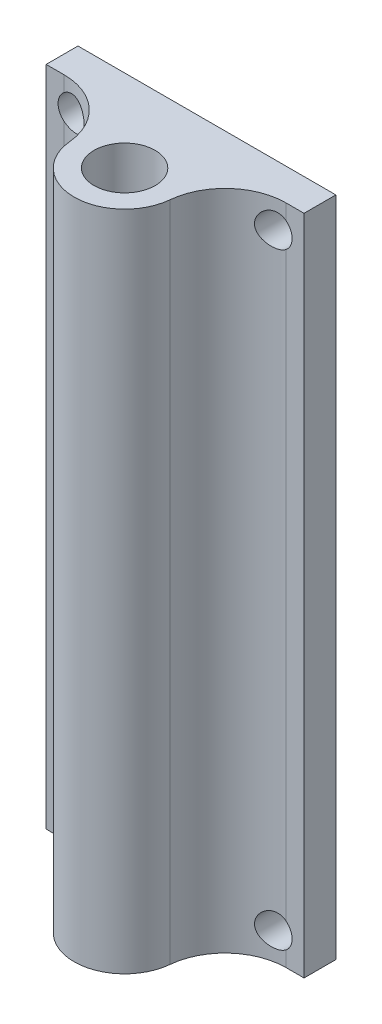
ISO-10303-21;
HEADER;
FILE_DESCRIPTION(('STEP AP214'),'2;1');
FILE_NAME('part.step','',(''),(''),'','','');
FILE_SCHEMA(('AUTOMOTIVE_DESIGN { 1 0 10303 214 1 1 1 1 }'));
ENDSEC;
DATA;
#1=APPLICATION_CONTEXT('core data for automotive mechanical design processes');
#2=APPLICATION_PROTOCOL_DEFINITION('international standard','automotive_design',2000,#1);
#3=PRODUCT_CONTEXT('',#1,'mechanical');
#4=PRODUCT('Part','Part','',(#3));
#5=PRODUCT_RELATED_PRODUCT_CATEGORY('part','',(#4));
#6=PRODUCT_DEFINITION_FORMATION('','',#4);
#7=PRODUCT_DEFINITION_CONTEXT('part definition',#1,'design');
#8=PRODUCT_DEFINITION('design','',#6,#7);
#9=PRODUCT_DEFINITION_SHAPE('','',#8);
#10=(LENGTH_UNIT() NAMED_UNIT(*) SI_UNIT(.MILLI.,.METRE.));
#11=(NAMED_UNIT(*) PLANE_ANGLE_UNIT() SI_UNIT($,.RADIAN.));
#12=(NAMED_UNIT(*) SI_UNIT($,.STERADIAN.) SOLID_ANGLE_UNIT());
#13=UNCERTAINTY_MEASURE_WITH_UNIT(LENGTH_MEASURE(1.E-05),#10,'distance_accuracy_value','');
#14=(GEOMETRIC_REPRESENTATION_CONTEXT(3) GLOBAL_UNCERTAINTY_ASSIGNED_CONTEXT((#13)) GLOBAL_UNIT_ASSIGNED_CONTEXT((#10,
#11,#12)) REPRESENTATION_CONTEXT('',''));
#15=CARTESIAN_POINT('',(0.,0.,0.));
#16=DIRECTION('',(0.,0.,1.));
#17=DIRECTION('',(1.,0.,0.));
#18=AXIS2_PLACEMENT_3D('',#15,#16,#17);
#19=CARTESIAN_POINT('',(0.,83.2,0.));
#20=DIRECTION('',(0.,-1.,0.));
#21=DIRECTION('',(0.,0.,-1.));
#22=AXIS2_PLACEMENT_3D('',#19,#20,#21);
#23=CYLINDRICAL_SURFACE('',#22,6.34);
#24=CARTESIAN_POINT('',(0.,83.2,0.));
#25=DIRECTION('',(0.,1.,0.));
#26=DIRECTION('',(0.,0.,1.));
#27=AXIS2_PLACEMENT_3D('',#24,#25,#26);
#28=CIRCLE('',#27,6.34);
#29=CARTESIAN_POINT('',(-6.31097527736789,83.2,0.605962910128388));
#30=VERTEX_POINT('',#29);
#31=CARTESIAN_POINT('',(6.31097527736789,83.2,0.605962910128388));
#32=VERTEX_POINT('',#31);
#33=EDGE_CURVE('E266',#30,#32,#28,.T.);
#34=ORIENTED_EDGE('',*,*,#33,.F.);
#35=DIRECTION('',(0.,-1.,0.));
#36=VECTOR('',#35,1.);
#37=CARTESIAN_POINT('',(-6.31097527736789,83.2,0.605962910128388));
#38=LINE('',#37,#36);
#39=CARTESIAN_POINT('',(-6.31097527736789,0.,0.605962910128388));
#40=VERTEX_POINT('',#39);
#41=EDGE_CURVE('E298',#30,#40,#38,.T.);
#42=ORIENTED_EDGE('',*,*,#41,.T.);
#43=CARTESIAN_POINT('',(0.,0.,0.));
#44=DIRECTION('',(0.,1.,0.));
#45=DIRECTION('',(0.,0.,1.));
#46=AXIS2_PLACEMENT_3D('',#43,#44,#45);
#47=CIRCLE('',#46,6.34);
#48=CARTESIAN_POINT('',(6.31097527736789,0.,0.605962910128388));
#49=VERTEX_POINT('',#48);
#50=EDGE_CURVE('E260',#40,#49,#47,.T.);
#51=ORIENTED_EDGE('',*,*,#50,.T.);
#52=DIRECTION('',(0.,-1.,0.));
#53=VECTOR('',#52,1.);
#54=CARTESIAN_POINT('',(6.31097527736789,83.2,0.605962910128388));
#55=LINE('',#54,#53);
#56=EDGE_CURVE('E295',#49,#32,#55,.F.);
#57=ORIENTED_EDGE('',*,*,#56,.T.);
#58=EDGE_LOOP('',(#34,#42,#51,#57));
#59=FACE_BOUND('',#58,.T.);
#60=ADVANCED_FACE('F45',(#59),#23,.T.);
#61=CARTESIAN_POINT('',(0.,83.2,-6.34));
#62=DIRECTION('',(0.,0.,-1.));
#63=DIRECTION('',(-1.,0.,0.));
#64=AXIS2_PLACEMENT_3D('',#61,#62,#63);
#65=PLANE('',#64);
#66=DIRECTION('',(0.,1.,0.));
#67=VECTOR('',#66,1.);
#68=CARTESIAN_POINT('',(13.9558159919082,0.,-6.34));
#69=LINE('',#68,#67);
#70=CARTESIAN_POINT('',(13.9558159919082,83.2,-6.34));
#71=VERTEX_POINT('',#70);
#72=CARTESIAN_POINT('',(13.9558159919082,81.2565751489946,-6.34));
#73=VERTEX_POINT('',#72);
#74=EDGE_CURVE('E166',#71,#73,#69,.F.);
#75=ORIENTED_EDGE('',*,*,#74,.T.);
#76=CARTESIAN_POINT('',(12.7,79.7,-6.34));
#77=DIRECTION('',(0.,0.,-1.));
#78=DIRECTION('',(-1.,0.,0.));
#79=AXIS2_PLACEMENT_3D('',#76,#77,#78);
#80=CIRCLE('',#79,2.00000000000001);
#81=CARTESIAN_POINT('',(13.9558159919082,78.1434248510053,-6.34));
#82=VERTEX_POINT('',#81);
#83=EDGE_CURVE('E366',#73,#82,#80,.T.);
#84=ORIENTED_EDGE('',*,*,#83,.T.);
#85=CARTESIAN_POINT('',(13.9558159919082,5.05657514899463,-6.34));
#86=VERTEX_POINT('',#85);
#87=EDGE_CURVE('E156',#82,#86,#69,.F.);
#88=ORIENTED_EDGE('',*,*,#87,.T.);
#89=CARTESIAN_POINT('',(12.7,3.49999999999999,-6.34));
#90=DIRECTION('',(0.,0.,-1.));
#91=DIRECTION('',(-1.,0.,0.));
#92=AXIS2_PLACEMENT_3D('',#89,#90,#91);
#93=CIRCLE('',#92,2.);
#94=CARTESIAN_POINT('',(13.9558159919082,1.94342485100536,-6.34));
#95=VERTEX_POINT('',#94);
#96=EDGE_CURVE('E141',#86,#95,#93,.T.);
#97=ORIENTED_EDGE('',*,*,#96,.T.);
#98=CARTESIAN_POINT('',(13.9558159919082,0.,-6.34));
#99=VERTEX_POINT('',#98);
#100=EDGE_CURVE('E153',#95,#99,#69,.F.);
#101=ORIENTED_EDGE('',*,*,#100,.T.);
#102=DIRECTION('',(1.,0.,0.));
#103=VECTOR('',#102,1.);
#104=CARTESIAN_POINT('',(0.,0.,-6.34));
#105=LINE('',#104,#103);
#106=CARTESIAN_POINT('',(16.2,0.,-6.34));
#107=VERTEX_POINT('',#106);
#108=EDGE_CURVE('E340',#99,#107,#105,.T.);
#109=ORIENTED_EDGE('',*,*,#108,.T.);
#110=DIRECTION('',(0.,-1.,0.));
#111=VECTOR('',#110,1.);
#112=CARTESIAN_POINT('',(16.2,83.2,-6.34));
#113=LINE('',#112,#111);
#114=CARTESIAN_POINT('',(16.2,83.2,-6.34));
#115=VERTEX_POINT('',#114);
#116=EDGE_CURVE('E291',#115,#107,#113,.T.);
#117=ORIENTED_EDGE('',*,*,#116,.F.);
#118=DIRECTION('',(1.,0.,0.));
#119=VECTOR('',#118,1.);
#120=CARTESIAN_POINT('',(0.,83.2,-6.34));
#121=LINE('',#120,#119);
#122=EDGE_CURVE('E273',#71,#115,#121,.T.);
#123=ORIENTED_EDGE('',*,*,#122,.F.);
#124=EDGE_LOOP('',(#75,#84,#88,#97,#101,#109,#117,#123));
#125=FACE_BOUND('',#124,.T.);
#126=ADVANCED_FACE('F152',(#125),#65,.F.);
#127=CARTESIAN_POINT('',(16.2,83.2,0.));
#128=DIRECTION('',(-1.,0.,0.));
#129=DIRECTION('',(0.,0.,1.));
#130=AXIS2_PLACEMENT_3D('',#127,#128,#129);
#131=PLANE('',#130);
#132=DIRECTION('',(0.,0.,-1.));
#133=VECTOR('',#132,1.);
#134=CARTESIAN_POINT('',(16.2,0.,0.));
#135=LINE('',#134,#133);
#136=CARTESIAN_POINT('',(16.2,0.,-10.34));
#137=VERTEX_POINT('',#136);
#138=EDGE_CURVE('E344',#107,#137,#135,.T.);
#139=ORIENTED_EDGE('',*,*,#138,.T.);
#140=DIRECTION('',(0.,-1.,0.));
#141=VECTOR('',#140,1.);
#142=CARTESIAN_POINT('',(16.2,83.2,-10.34));
#143=LINE('',#142,#141);
#144=CARTESIAN_POINT('',(16.2,83.2,-10.34));
#145=VERTEX_POINT('',#144);
#146=EDGE_CURVE('E288',#145,#137,#143,.T.);
#147=ORIENTED_EDGE('',*,*,#146,.F.);
#148=DIRECTION('',(0.,0.,-1.));
#149=VECTOR('',#148,1.);
#150=CARTESIAN_POINT('',(16.2,83.2,0.));
#151=LINE('',#150,#149);
#152=EDGE_CURVE('E319',#115,#145,#151,.T.);
#153=ORIENTED_EDGE('',*,*,#152,.F.);
#154=ORIENTED_EDGE('',*,*,#116,.T.);
#155=EDGE_LOOP('',(#139,#147,#153,#154));
#156=FACE_BOUND('',#155,.T.);
#157=ADVANCED_FACE('F234',(#156),#131,.F.);
#158=CARTESIAN_POINT('',(0.,83.2,-10.34));
#159=DIRECTION('',(0.,0.,-1.));
#160=DIRECTION('',(-1.,0.,0.));
#161=AXIS2_PLACEMENT_3D('',#158,#159,#160);
#162=PLANE('',#161);
#163=CARTESIAN_POINT('',(12.7,79.7,-10.34));
#164=DIRECTION('',(0.,0.,-1.));
#165=DIRECTION('',(-1.,0.,0.));
#166=AXIS2_PLACEMENT_3D('',#163,#164,#165);
#167=CIRCLE('',#166,2.00000000000001);
#168=CARTESIAN_POINT('',(10.7,79.7,-10.34));
#169=VERTEX_POINT('',#168);
#170=EDGE_CURVE('E360',#169,#169,#167,.T.);
#171=ORIENTED_EDGE('',*,*,#170,.F.);
#172=EDGE_LOOP('',(#171));
#173=FACE_BOUND('',#172,.T.);
#174=CARTESIAN_POINT('',(12.7,3.49999999999999,-10.34));
#175=DIRECTION('',(0.,0.,-1.));
#176=DIRECTION('',(-1.,0.,0.));
#177=AXIS2_PLACEMENT_3D('',#174,#175,#176);
#178=CIRCLE('',#177,2.);
#179=CARTESIAN_POINT('',(10.7,3.49999999999999,-10.34));
#180=VERTEX_POINT('',#179);
#181=EDGE_CURVE('E158',#180,#180,#178,.T.);
#182=ORIENTED_EDGE('',*,*,#181,.F.);
#183=EDGE_LOOP('',(#182));
#184=FACE_BOUND('',#183,.T.);
#185=CARTESIAN_POINT('',(-12.7,3.49999999999999,-10.34));
#186=DIRECTION('',(0.,0.,-1.));
#187=DIRECTION('',(-1.,0.,0.));
#188=AXIS2_PLACEMENT_3D('',#185,#186,#187);
#189=CIRCLE('',#188,2.);
#190=CARTESIAN_POINT('',(-14.7,3.49999999999999,-10.34));
#191=VERTEX_POINT('',#190);
#192=EDGE_CURVE('E341',#191,#191,#189,.T.);
#193=ORIENTED_EDGE('',*,*,#192,.F.);
#194=EDGE_LOOP('',(#193));
#195=FACE_BOUND('',#194,.T.);
#196=CARTESIAN_POINT('',(-12.7,79.7,-10.34));
#197=DIRECTION('',(0.,0.,-1.));
#198=DIRECTION('',(-1.,0.,0.));
#199=AXIS2_PLACEMENT_3D('',#196,#197,#198);
#200=CIRCLE('',#199,2.);
#201=CARTESIAN_POINT('',(-14.7,79.7,-10.34));
#202=VERTEX_POINT('',#201);
#203=EDGE_CURVE('E359',#202,#202,#200,.T.);
#204=ORIENTED_EDGE('',*,*,#203,.F.);
#205=EDGE_LOOP('',(#204));
#206=FACE_BOUND('',#205,.T.);
#207=DIRECTION('',(1.,0.,0.));
#208=VECTOR('',#207,1.);
#209=CARTESIAN_POINT('',(0.,0.,-10.34));
#210=LINE('',#209,#208);
#211=CARTESIAN_POINT('',(-16.2,0.,-10.34));
#212=VERTEX_POINT('',#211);
#213=EDGE_CURVE('E348',#212,#137,#210,.T.);
#214=ORIENTED_EDGE('',*,*,#213,.F.);
#215=DIRECTION('',(0.,-1.,0.));
#216=VECTOR('',#215,1.);
#217=CARTESIAN_POINT('',(-16.2,83.2,-10.34));
#218=LINE('',#217,#216);
#219=CARTESIAN_POINT('',(-16.2,83.2,-10.34));
#220=VERTEX_POINT('',#219);
#221=EDGE_CURVE('E284',#220,#212,#218,.T.);
#222=ORIENTED_EDGE('',*,*,#221,.F.);
#223=DIRECTION('',(1.,0.,0.));
#224=VECTOR('',#223,1.);
#225=CARTESIAN_POINT('',(0.,83.2,-10.34));
#226=LINE('',#225,#224);
#227=EDGE_CURVE('E322',#220,#145,#226,.T.);
#228=ORIENTED_EDGE('',*,*,#227,.T.);
#229=ORIENTED_EDGE('',*,*,#146,.T.);
#230=EDGE_LOOP('',(#214,#222,#228,#229));
#231=FACE_BOUND('',#230,.T.);
#232=ADVANCED_FACE('F237',(#173,#184,#195,#206,#231),#162,.T.);
#233=CARTESIAN_POINT('',(-16.2,83.2,0.));
#234=DIRECTION('',(-1.,0.,0.));
#235=DIRECTION('',(0.,0.,1.));
#236=AXIS2_PLACEMENT_3D('',#233,#234,#235);
#237=PLANE('',#236);
#238=DIRECTION('',(0.,0.,-1.));
#239=VECTOR('',#238,1.);
#240=CARTESIAN_POINT('',(-16.2,0.,0.));
#241=LINE('',#240,#239);
#242=CARTESIAN_POINT('',(-16.2,0.,-6.34));
#243=VERTEX_POINT('',#242);
#244=EDGE_CURVE('E276',#243,#212,#241,.T.);
#245=ORIENTED_EDGE('',*,*,#244,.F.);
#246=DIRECTION('',(0.,-1.,0.));
#247=VECTOR('',#246,1.);
#248=CARTESIAN_POINT('',(-16.2,83.2,-6.34));
#249=LINE('',#248,#247);
#250=CARTESIAN_POINT('',(-16.2,83.2,-6.34));
#251=VERTEX_POINT('',#250);
#252=EDGE_CURVE('E280',#251,#243,#249,.T.);
#253=ORIENTED_EDGE('',*,*,#252,.F.);
#254=DIRECTION('',(0.,0.,-1.));
#255=VECTOR('',#254,1.);
#256=CARTESIAN_POINT('',(-16.2,83.2,0.));
#257=LINE('',#256,#255);
#258=EDGE_CURVE('E329',#251,#220,#257,.T.);
#259=ORIENTED_EDGE('',*,*,#258,.T.);
#260=ORIENTED_EDGE('',*,*,#221,.T.);
#261=EDGE_LOOP('',(#245,#253,#259,#260));
#262=FACE_BOUND('',#261,.T.);
#263=ADVANCED_FACE('F241',(#262),#237,.T.);
#264=CARTESIAN_POINT('',(0.,83.2,-6.34));
#265=DIRECTION('',(0.,0.,1.));
#266=DIRECTION('',(1.,0.,0.));
#267=AXIS2_PLACEMENT_3D('',#264,#265,#266);
#268=PLANE('',#267);
#269=CARTESIAN_POINT('',(-12.7,3.49999999999999,-6.34));
#270=DIRECTION('',(0.,0.,1.));
#271=DIRECTION('',(1.,0.,0.));
#272=AXIS2_PLACEMENT_3D('',#269,#270,#271);
#273=CIRCLE('',#272,2.);
#274=CARTESIAN_POINT('',(-13.9558159919082,5.05657514899463,-6.34));
#275=VERTEX_POINT('',#274);
#276=CARTESIAN_POINT('',(-13.9558159919082,1.94342485100535,-6.34));
#277=VERTEX_POINT('',#276);
#278=EDGE_CURVE('E72',#275,#277,#273,.T.);
#279=ORIENTED_EDGE('',*,*,#278,.F.);
#280=DIRECTION('',(0.,-1.,0.));
#281=VECTOR('',#280,1.);
#282=CARTESIAN_POINT('',(-13.9558159919082,83.2,-6.34));
#283=LINE('',#282,#281);
#284=CARTESIAN_POINT('',(-13.9558159919082,78.1434248510053,-6.34));
#285=VERTEX_POINT('',#284);
#286=EDGE_CURVE('E171',#275,#285,#283,.F.);
#287=ORIENTED_EDGE('',*,*,#286,.T.);
#288=CARTESIAN_POINT('',(-12.7,79.7,-6.34));
#289=DIRECTION('',(0.,0.,1.));
#290=DIRECTION('',(1.,0.,0.));
#291=AXIS2_PLACEMENT_3D('',#288,#289,#290);
#292=CIRCLE('',#291,2.);
#293=CARTESIAN_POINT('',(-13.9558159919082,81.2565751489946,-6.34));
#294=VERTEX_POINT('',#293);
#295=EDGE_CURVE('E65',#294,#285,#292,.T.);
#296=ORIENTED_EDGE('',*,*,#295,.F.);
#297=CARTESIAN_POINT('',(-13.9558159919082,83.2,-6.34));
#298=VERTEX_POINT('',#297);
#299=EDGE_CURVE('E173',#294,#298,#283,.F.);
#300=ORIENTED_EDGE('',*,*,#299,.T.);
#301=DIRECTION('',(-1.,0.,0.));
#302=VECTOR('',#301,1.);
#303=CARTESIAN_POINT('',(0.,83.2,-6.34));
#304=LINE('',#303,#302);
#305=EDGE_CURVE('E314',#298,#251,#304,.T.);
#306=ORIENTED_EDGE('',*,*,#305,.T.);
#307=ORIENTED_EDGE('',*,*,#252,.T.);
#308=DIRECTION('',(-1.,0.,0.));
#309=VECTOR('',#308,1.);
#310=CARTESIAN_POINT('',(0.,0.,-6.34));
#311=LINE('',#310,#309);
#312=CARTESIAN_POINT('',(-13.9558159919082,0.,-6.34));
#313=VERTEX_POINT('',#312);
#314=EDGE_CURVE('E267',#313,#243,#311,.T.);
#315=ORIENTED_EDGE('',*,*,#314,.F.);
#316=EDGE_CURVE('E164',#313,#277,#283,.F.);
#317=ORIENTED_EDGE('',*,*,#316,.T.);
#318=EDGE_LOOP('',(#279,#287,#296,#300,#306,#307,#315,#317));
#319=FACE_BOUND('',#318,.T.);
#320=ADVANCED_FACE('F245',(#319),#268,.T.);
#321=CARTESIAN_POINT('',(0.,83.2,0.));
#322=DIRECTION('',(0.,-1.,0.));
#323=DIRECTION('',(0.,0.,-1.));
#324=AXIS2_PLACEMENT_3D('',#321,#322,#323);
#325=CYLINDRICAL_SURFACE('',#324,3.84);
#326=CARTESIAN_POINT('',(0.,83.2,0.));
#327=DIRECTION('',(0.,1.,0.));
#328=DIRECTION('',(0.,0.,1.));
#329=AXIS2_PLACEMENT_3D('',#326,#327,#328);
#330=CIRCLE('',#329,3.84);
#331=CARTESIAN_POINT('',(0.,83.2,3.84));
#332=VERTEX_POINT('',#331);
#333=EDGE_CURVE('E285',#332,#332,#330,.T.);
#334=ORIENTED_EDGE('',*,*,#333,.T.);
#335=EDGE_LOOP('',(#334));
#336=FACE_BOUND('',#335,.T.);
#337=CARTESIAN_POINT('',(0.,0.,0.));
#338=DIRECTION('',(0.,1.,0.));
#339=DIRECTION('',(0.,0.,1.));
#340=AXIS2_PLACEMENT_3D('',#337,#338,#339);
#341=CIRCLE('',#340,3.84);
#342=CARTESIAN_POINT('',(0.,0.,3.84));
#343=VERTEX_POINT('',#342);
#344=EDGE_CURVE('E263',#343,#343,#341,.T.);
#345=ORIENTED_EDGE('',*,*,#344,.F.);
#346=EDGE_LOOP('',(#345));
#347=FACE_BOUND('',#346,.T.);
#348=ADVANCED_FACE('F249',(#336,#347),#325,.F.);
#349=CARTESIAN_POINT('',(0.,83.2,0.));
#350=DIRECTION('',(0.,1.,0.));
#351=DIRECTION('',(0.,0.,1.));
#352=AXIS2_PLACEMENT_3D('',#349,#350,#351);
#353=PLANE('',#352);
#354=ORIENTED_EDGE('',*,*,#305,.F.);
#355=CARTESIAN_POINT('',(-13.9558159919082,83.2,1.34));
#356=DIRECTION('',(0.,1.,0.));
#357=DIRECTION('',(0.,0.,1.));
#358=AXIS2_PLACEMENT_3D('',#355,#356,#357);
#359=CIRCLE('',#358,7.68);
#360=EDGE_CURVE('E181',#298,#30,#359,.F.);
#361=ORIENTED_EDGE('',*,*,#360,.T.);
#362=ORIENTED_EDGE('',*,*,#33,.T.);
#363=CARTESIAN_POINT('',(13.9558159919082,83.2,1.34));
#364=DIRECTION('',(0.,1.,0.));
#365=DIRECTION('',(0.,0.,1.));
#366=AXIS2_PLACEMENT_3D('',#363,#364,#365);
#367=CIRCLE('',#366,7.68);
#368=EDGE_CURVE('E148',#32,#71,#367,.F.);
#369=ORIENTED_EDGE('',*,*,#368,.T.);
#370=ORIENTED_EDGE('',*,*,#122,.T.);
#371=ORIENTED_EDGE('',*,*,#152,.T.);
#372=ORIENTED_EDGE('',*,*,#227,.F.);
#373=ORIENTED_EDGE('',*,*,#258,.F.);
#374=EDGE_LOOP('',(#354,#361,#362,#369,#370,#371,#372,#373));
#375=FACE_BOUND('',#374,.T.);
#376=ORIENTED_EDGE('',*,*,#333,.F.);
#377=EDGE_LOOP('',(#376));
#378=FACE_BOUND('',#377,.T.);
#379=ADVANCED_FACE('F216',(#375,#378),#353,.T.);
#380=CARTESIAN_POINT('',(0.,0.,0.));
#381=DIRECTION('',(0.,1.,0.));
#382=DIRECTION('',(0.,0.,1.));
#383=AXIS2_PLACEMENT_3D('',#380,#381,#382);
#384=PLANE('',#383);
#385=ORIENTED_EDGE('',*,*,#50,.F.);
#386=CARTESIAN_POINT('',(-13.9558159919082,0.,1.34));
#387=DIRECTION('',(0.,1.,0.));
#388=DIRECTION('',(0.,0.,1.));
#389=AXIS2_PLACEMENT_3D('',#386,#387,#388);
#390=CIRCLE('',#389,7.68);
#391=EDGE_CURVE('E176',#40,#313,#390,.T.);
#392=ORIENTED_EDGE('',*,*,#391,.T.);
#393=ORIENTED_EDGE('',*,*,#314,.T.);
#394=ORIENTED_EDGE('',*,*,#244,.T.);
#395=ORIENTED_EDGE('',*,*,#213,.T.);
#396=ORIENTED_EDGE('',*,*,#138,.F.);
#397=ORIENTED_EDGE('',*,*,#108,.F.);
#398=CARTESIAN_POINT('',(13.9558159919082,0.,1.34));
#399=DIRECTION('',(0.,1.,0.));
#400=DIRECTION('',(0.,0.,1.));
#401=AXIS2_PLACEMENT_3D('',#398,#399,#400);
#402=CIRCLE('',#401,7.68);
#403=EDGE_CURVE('E161',#99,#49,#402,.T.);
#404=ORIENTED_EDGE('',*,*,#403,.T.);
#405=EDGE_LOOP('',(#385,#392,#393,#394,#395,#396,#397,#404));
#406=FACE_BOUND('',#405,.T.);
#407=ORIENTED_EDGE('',*,*,#344,.T.);
#408=EDGE_LOOP('',(#407));
#409=FACE_BOUND('',#408,.T.);
#410=ADVANCED_FACE('F226',(#406,#409),#384,.F.);
#411=CARTESIAN_POINT('',(-13.9558159919082,83.2,1.34));
#412=DIRECTION('',(0.,-1.,0.));
#413=DIRECTION('',(0.,0.,-1.));
#414=AXIS2_PLACEMENT_3D('',#411,#412,#413);
#415=CYLINDRICAL_SURFACE('',#414,7.68);
#416=ORIENTED_EDGE('',*,*,#286,.F.);
#417=CARTESIAN_POINT('',(-13.9558159919082,5.05657514899463,-6.34));
#418=CARTESIAN_POINT('',(-13.8702324707879,5.1256194487321,-6.33999871740539));
#419=CARTESIAN_POINT('',(-13.7789206832588,5.18760532475056,-6.3385606549177));
#420=CARTESIAN_POINT('',(-13.5874443616998,5.29569892722417,-6.3317580380105));
#421=CARTESIAN_POINT('',(-13.4872776803809,5.34180278898529,-6.32639252888599));
#422=CARTESIAN_POINT('',(-13.2810378732316,5.416882159956,-6.31099718143919));
#423=CARTESIAN_POINT('',(-13.1749640414496,5.44585561711823,-6.30096678456804));
#424=CARTESIAN_POINT('',(-12.960087759229,5.48602673747936,-6.27594518523544));
#425=CARTESIAN_POINT('',(-12.8512854749883,5.49722548072878,-6.26095428425755));
#426=CARTESIAN_POINT('',(-12.6342085650277,5.50186076223654,-6.22622919483338));
#427=CARTESIAN_POINT('',(-12.525933474724,5.49531781908645,-6.20650050978094));
#428=CARTESIAN_POINT('',(-12.3126586121565,5.46508887188854,-6.16295216451284));
#429=CARTESIAN_POINT('',(-12.2076594122902,5.44139988921253,-6.13913179403367));
#430=CARTESIAN_POINT('',(-11.9999215784337,5.37673457082818,-6.08756534954626));
#431=CARTESIAN_POINT('',(-11.8973879276359,5.33518670240231,-6.05971170858855));
#432=CARTESIAN_POINT('',(-11.7009109705249,5.23606981953398,-6.00222702763774));
#433=CARTESIAN_POINT('',(-11.6069704774661,5.17849558309375,-5.97259541078558));
#434=CARTESIAN_POINT('',(-11.4254885920492,5.04559777310098,-5.91185762686719));
#435=CARTESIAN_POINT('',(-11.3384767039303,4.96955021771116,-5.88074948081424));
#436=CARTESIAN_POINT('',(-11.1784453193398,4.80314907728198,-5.82072139139416));
#437=CARTESIAN_POINT('',(-11.105428226671,4.71279303941818,-5.79180182446159));
#438=CARTESIAN_POINT('',(-10.9756303189598,4.51983492397461,-5.7385469883183));
#439=CARTESIAN_POINT('',(-10.9188488633746,4.41723332974385,-5.71421153826385));
#440=CARTESIAN_POINT('',(-10.8237640775259,4.20249502189553,-5.6725153037993));
#441=CARTESIAN_POINT('',(-10.7854476799476,4.09036511755257,-5.65514958852055));
#442=CARTESIAN_POINT('',(-10.7312402598187,3.86878360263483,-5.63031836329529));
#443=CARTESIAN_POINT('',(-10.7138798427085,3.75976441713571,-5.62220669858042));
#444=CARTESIAN_POINT('',(-10.6973740009814,3.54007572958625,-5.61449851584868));
#445=CARTESIAN_POINT('',(-10.6982201638313,3.42940701333941,-5.61489806513902));
#446=CARTESIAN_POINT('',(-10.7173701466603,3.21769731796029,-5.62383196401696));
#447=CARTESIAN_POINT('',(-10.7344639578578,3.11651936967573,-5.63180245684354));
#448=CARTESIAN_POINT('',(-10.7836414188817,2.91865207836237,-5.65431431018175));
#449=CARTESIAN_POINT('',(-10.8157268328432,2.82196326506451,-5.66885644400385));
#450=CARTESIAN_POINT('',(-10.8945749963705,2.63332557256435,-5.70365595324661));
#451=CARTESIAN_POINT('',(-10.9416454846432,2.54152801799151,-5.72403216587299));
#452=CARTESIAN_POINT('',(-11.048750045021,2.36691816674915,-5.76877838287828));
#453=CARTESIAN_POINT('',(-11.1087885890733,2.28410898449782,-5.79314976426373));
#454=CARTESIAN_POINT('',(-11.2458199145463,2.1225028302913,-5.84638663680281));
#455=CARTESIAN_POINT('',(-11.3238097200467,2.04461811288315,-5.87545745963499));
#456=CARTESIAN_POINT('',(-11.4913246078086,1.90276506500402,-5.93437730966808));
#457=CARTESIAN_POINT('',(-11.5808539514703,1.83880189915883,-5.96422662109016));
#458=CARTESIAN_POINT('',(-11.7748134087749,1.72306749615896,-6.02454346094976));
#459=CARTESIAN_POINT('',(-11.8798007457699,1.67219390009301,-6.05494997697237));
#460=CARTESIAN_POINT('',(-12.0977636566089,1.58926668292353,-6.11270008179787));
#461=CARTESIAN_POINT('',(-12.2107384542322,1.55721123588296,-6.14004396756131));
#462=CARTESIAN_POINT('',(-12.4395977266044,1.51366567421,-6.18973797325884));
#463=CARTESIAN_POINT('',(-12.5554005880094,1.5018366599267,-6.21216478276479));
#464=CARTESIAN_POINT('',(-12.7882021633428,1.49856093990549,-6.25164008495515));
#465=CARTESIAN_POINT('',(-12.9052004535399,1.50710724554997,-6.26869041946825));
#466=CARTESIAN_POINT('',(-13.130735445964,1.54376377524116,-6.29635456572495));
#467=CARTESIAN_POINT('',(-13.2394018623571,1.5708690065525,-6.30724883493525));
#468=CARTESIAN_POINT('',(-13.4510146128198,1.64299505799269,-6.32412708903491));
#469=CARTESIAN_POINT('',(-13.5539616127742,1.68801378753504,-6.33011164666043));
#470=CARTESIAN_POINT('',(-13.748777189202,1.79352190753506,-6.33781502367249));
#471=CARTESIAN_POINT('',(-13.8408416321834,1.85364388207707,-6.33962600046823));
#472=CARTESIAN_POINT('',(-14.0138946044543,1.98814934687361,-6.34026862422081));
#473=CARTESIAN_POINT('',(-14.0948824274673,2.06253374581488,-6.3391000812883));
#474=CARTESIAN_POINT('',(-14.2444786657519,2.22450511220223,-6.33494332656253));
#475=CARTESIAN_POINT('',(-14.3129241109409,2.31224199002758,-6.33193310282491));
#476=CARTESIAN_POINT('',(-14.4343404162411,2.49782189553572,-6.32531952801928));
#477=CARTESIAN_POINT('',(-14.487310194258,2.59566562926603,-6.32171613550308));
#478=CARTESIAN_POINT('',(-14.5769339674667,2.80017822170822,-6.31497691044974));
#479=CARTESIAN_POINT('',(-14.6133558966063,2.90694913475678,-6.31184811512877));
#480=CARTESIAN_POINT('',(-14.6677656371096,3.12511716887412,-6.3069785849278));
#481=CARTESIAN_POINT('',(-14.6857541224803,3.23651412063974,-6.30523779929662));
#482=CARTESIAN_POINT('',(-14.7027590602813,3.46056240525649,-6.30359544316752));
#483=CARTESIAN_POINT('',(-14.7018090813015,3.5732111649813,-6.30369061840355));
#484=CARTESIAN_POINT('',(-14.6810453140098,3.79674946234226,-6.30568819934737));
#485=CARTESIAN_POINT('',(-14.6612299047502,3.90763884797784,-6.30759076034857));
#486=CARTESIAN_POINT('',(-14.6033742681667,4.12426939820885,-6.31270552086519));
#487=CARTESIAN_POINT('',(-14.5653720429405,4.23002079359148,-6.31591498747177));
#488=CARTESIAN_POINT('',(-14.4722394930096,4.43364453287106,-6.32275891377751));
#489=CARTESIAN_POINT('',(-14.4171153175135,4.53151968959086,-6.32639322060701));
#490=CARTESIAN_POINT('',(-14.2989364260266,4.70543872541949,-6.33253016815177));
#491=CARTESIAN_POINT('',(-14.2376538765575,4.78269071338194,-6.33511659547433));
#492=CARTESIAN_POINT('',(-14.1043811717144,4.92737013000459,-6.33885205119013));
#493=CARTESIAN_POINT('',(-14.0323915231719,4.99479802339944,-6.34000114759667));
#494=CARTESIAN_POINT('',(-13.9558159919082,5.05657514899463,-6.34));
#495=B_SPLINE_CURVE_WITH_KNOTS('',3,(#417,#418,#419,#420,#421,#422,#423,#424,#425,#426,#427,
#428,#429,#430,#431,#432,#433,#434,#435,#436,#437,#438,#439,#440,#441,#442,#443,#444,#445,#446,
#447,#448,#449,#450,#451,#452,#453,#454,#455,#456,#457,#458,#459,#460,#461,#462,#463,#464,#465,
#466,#467,#468,#469,#470,#471,#472,#473,#474,#475,#476,#477,#478,#479,#480,#481,#482,#483,#484,
#485,#486,#487,#488,#489,#490,#491,#492,#493,#494),.UNSPECIFIED.,.T.,.F.,(4,2,2,2,2,2,2,2,2,2,2,
2,2,2,2,2,2,2,2,2,2,2,2,2,2,2,2,2,2,2,2,2,2,2,2,2,2,2,4),(0.,0.329540810680635,
0.659161754538522,0.988822175620382,1.3184625646756,1.64772188111718,1.97703841056963,
2.31778612313704,2.65864499444507,3.01599541760339,3.37340716582487,3.73080481117405,
4.08794916130793,4.41824296229591,4.74838415099314,5.05571926341866,5.36309055057986,
5.6772325024505,5.99148295751292,6.33197101223502,6.67258516693509,7.03252482790956,
7.39242955793327,7.74624264427672,8.09993439222558,8.43584748614367,8.77172138897278,
9.10010467321976,9.42850888635958,9.76091704758073,10.0933484459871,10.4303079150196,
10.7672550629032,11.1036050222717,11.4399838839688,11.7756629169187,12.111221532608,
12.4060908779033,12.7009462696962),.UNSPECIFIED.);
#496=EDGE_CURVE('E11',#275,#277,#495,.T.);
#497=ORIENTED_EDGE('',*,*,#496,.T.);
#498=ORIENTED_EDGE('',*,*,#316,.F.);
#499=ORIENTED_EDGE('',*,*,#391,.F.);
#500=ORIENTED_EDGE('',*,*,#41,.F.);
#501=ORIENTED_EDGE('',*,*,#360,.F.);
#502=ORIENTED_EDGE('',*,*,#299,.F.);
#503=CARTESIAN_POINT('',(-13.9558159919082,81.2565751489946,-6.34));
#504=CARTESIAN_POINT('',(-13.8702324707879,81.3256194487321,-6.33999871740539));
#505=CARTESIAN_POINT('',(-13.7789206832588,81.3876053247506,-6.3385606549177));
#506=CARTESIAN_POINT('',(-13.5874443616999,81.4956989272242,-6.3317580380105));
#507=CARTESIAN_POINT('',(-13.4872776803809,81.5418027889853,-6.32639252888599));
#508=CARTESIAN_POINT('',(-13.2810378732316,81.616882159956,-6.31099718143919));
#509=CARTESIAN_POINT('',(-13.1749640414496,81.6458556171182,-6.30096678456804));
#510=CARTESIAN_POINT('',(-12.960087759229,81.6860267374794,-6.27594518523544));
#511=CARTESIAN_POINT('',(-12.8512854749883,81.6972254807288,-6.26095428425755));
#512=CARTESIAN_POINT('',(-12.6342085650277,81.7018607622365,-6.22622919483338));
#513=CARTESIAN_POINT('',(-12.525933474724,81.6953178190864,-6.20650050978094));
#514=CARTESIAN_POINT('',(-12.3126586121565,81.6650888718885,-6.16295216451284));
#515=CARTESIAN_POINT('',(-12.2076594122902,81.6413998892125,-6.13913179403367));
#516=CARTESIAN_POINT('',(-11.9999215784337,81.5767345708282,-6.08756534954626));
#517=CARTESIAN_POINT('',(-11.8973879276359,81.5351867024023,-6.05971170858855));
#518=CARTESIAN_POINT('',(-11.700910970525,81.436069819534,-6.00222702763774));
#519=CARTESIAN_POINT('',(-11.6069704774662,81.3784955830938,-5.97259541078558));
#520=CARTESIAN_POINT('',(-11.4254885920492,81.245597773101,-5.91185762686719));
#521=CARTESIAN_POINT('',(-11.3384767039304,81.1695502177112,-5.88074948081425));
#522=CARTESIAN_POINT('',(-11.1784453193398,81.003149077282,-5.82072139139416));
#523=CARTESIAN_POINT('',(-11.105428226671,80.9127930394182,-5.79180182446159));
#524=CARTESIAN_POINT('',(-10.9756303189598,80.7198349239746,-5.7385469883183));
#525=CARTESIAN_POINT('',(-10.9188488633746,80.6172333297439,-5.71421153826385));
#526=CARTESIAN_POINT('',(-10.8237640775259,80.4024950218955,-5.6725153037993));
#527=CARTESIAN_POINT('',(-10.7854476799476,80.2903651175526,-5.65514958852055));
#528=CARTESIAN_POINT('',(-10.7312402598187,80.0687836026349,-5.63031836329529));
#529=CARTESIAN_POINT('',(-10.7138798427085,79.9597644171357,-5.62220669858041));
#530=CARTESIAN_POINT('',(-10.6973740009814,79.7400757295863,-5.61449851584868));
#531=CARTESIAN_POINT('',(-10.6982201638313,79.6294070133394,-5.61489806513902));
#532=CARTESIAN_POINT('',(-10.7173701466603,79.4176973179603,-5.62383196401696));
#533=CARTESIAN_POINT('',(-10.7344639578578,79.3165193696757,-5.63180245684354));
#534=CARTESIAN_POINT('',(-10.7836414188817,79.1186520783624,-5.65431431018174));
#535=CARTESIAN_POINT('',(-10.8157268328432,79.0219632650645,-5.66885644400385));
#536=CARTESIAN_POINT('',(-10.8945749963705,78.8333255725643,-5.7036559532466));
#537=CARTESIAN_POINT('',(-10.9416454846432,78.7415280179915,-5.72403216587298));
#538=CARTESIAN_POINT('',(-11.048750045021,78.5669181667492,-5.76877838287827));
#539=CARTESIAN_POINT('',(-11.1087885890732,78.4841089844978,-5.79314976426373));
#540=CARTESIAN_POINT('',(-11.2458199145463,78.3225028302913,-5.84638663680281));
#541=CARTESIAN_POINT('',(-11.3238097200467,78.2446181128832,-5.87545745963499));
#542=CARTESIAN_POINT('',(-11.4913246078086,78.102765065004,-5.93437730966808));
#543=CARTESIAN_POINT('',(-11.5808539514703,78.0388018991588,-5.96422662109016));
#544=CARTESIAN_POINT('',(-11.7748134087748,77.923067496159,-6.02454346094975));
#545=CARTESIAN_POINT('',(-11.8798007457698,77.872193900093,-6.05494997697237));
#546=CARTESIAN_POINT('',(-12.0977636566089,77.7892666829235,-6.11270008179786));
#547=CARTESIAN_POINT('',(-12.2107384542322,77.757211235883,-6.1400439675613));
#548=CARTESIAN_POINT('',(-12.4395977266044,77.71366567421,-6.18973797325884));
#549=CARTESIAN_POINT('',(-12.5554005880094,77.7018366599267,-6.21216478276479));
#550=CARTESIAN_POINT('',(-12.7882021633428,77.6985609399055,-6.25164008495515));
#551=CARTESIAN_POINT('',(-12.9052004535399,77.70710724555,-6.26869041946825));
#552=CARTESIAN_POINT('',(-13.130735445964,77.7437637752412,-6.29635456572495));
#553=CARTESIAN_POINT('',(-13.2394018623571,77.7708690065525,-6.30724883493525));
#554=CARTESIAN_POINT('',(-13.4510146128198,77.8429950579927,-6.32412708903491));
#555=CARTESIAN_POINT('',(-13.5539616127742,77.888013787535,-6.33011164666043));
#556=CARTESIAN_POINT('',(-13.748777189202,77.9935219075351,-6.33781502367249));
#557=CARTESIAN_POINT('',(-13.8408416321834,78.0536438820771,-6.33962600046823));
#558=CARTESIAN_POINT('',(-14.0138946044543,78.1881493468736,-6.34026862422081));
#559=CARTESIAN_POINT('',(-14.0948824274673,78.2625337458149,-6.3391000812883));
#560=CARTESIAN_POINT('',(-14.2444786657519,78.4245051122022,-6.33494332656253));
#561=CARTESIAN_POINT('',(-14.3129241109409,78.5122419900276,-6.33193310282491));
#562=CARTESIAN_POINT('',(-14.4343404162411,78.6978218955357,-6.32531952801928));
#563=CARTESIAN_POINT('',(-14.4873101942579,78.795665629266,-6.32171613550308));
#564=CARTESIAN_POINT('',(-14.5769339674667,79.0001782217082,-6.31497691044974));
#565=CARTESIAN_POINT('',(-14.6133558966063,79.1069491347568,-6.31184811512877));
#566=CARTESIAN_POINT('',(-14.6677656371096,79.3251171688741,-6.3069785849278));
#567=CARTESIAN_POINT('',(-14.6857541224803,79.4365141206397,-6.30523779929662));
#568=CARTESIAN_POINT('',(-14.7027590602813,79.6605624052565,-6.30359544316752));
#569=CARTESIAN_POINT('',(-14.7018090813015,79.7732111649813,-6.30369061840355));
#570=CARTESIAN_POINT('',(-14.6810453140098,79.9967494623423,-6.30568819934737));
#571=CARTESIAN_POINT('',(-14.6612299047502,80.1076388479778,-6.30759076034857));
#572=CARTESIAN_POINT('',(-14.6033742681667,80.3242693982088,-6.31270552086519));
#573=CARTESIAN_POINT('',(-14.5653720429405,80.4300207935915,-6.31591498747177));
#574=CARTESIAN_POINT('',(-14.4722394930096,80.633644532871,-6.32275891377751));
#575=CARTESIAN_POINT('',(-14.4171153175135,80.7315196895908,-6.32639322060701));
#576=CARTESIAN_POINT('',(-14.2989364260266,80.9054387254195,-6.33253016815177));
#577=CARTESIAN_POINT('',(-14.2376538765576,80.9826907133819,-6.33511659547433));
#578=CARTESIAN_POINT('',(-14.1043811717145,81.1273701300046,-6.33885205119013));
#579=CARTESIAN_POINT('',(-14.0323915231719,81.1947980233994,-6.34000114759667));
#580=CARTESIAN_POINT('',(-13.9558159919082,81.2565751489946,-6.34));
#581=B_SPLINE_CURVE_WITH_KNOTS('',3,(#503,#504,#505,#506,#507,#508,#509,#510,#511,#512,#513,
#514,#515,#516,#517,#518,#519,#520,#521,#522,#523,#524,#525,#526,#527,#528,#529,#530,#531,#532,
#533,#534,#535,#536,#537,#538,#539,#540,#541,#542,#543,#544,#545,#546,#547,#548,#549,#550,#551,
#552,#553,#554,#555,#556,#557,#558,#559,#560,#561,#562,#563,#564,#565,#566,#567,#568,#569,#570,
#571,#572,#573,#574,#575,#576,#577,#578,#579,#580),.UNSPECIFIED.,.T.,.F.,(4,2,2,2,2,2,2,2,2,2,2,
2,2,2,2,2,2,2,2,2,2,2,2,2,2,2,2,2,2,2,2,2,2,2,2,2,2,2,4),(0.,0.329540810680626,
0.659161754538512,0.988822175620369,1.31846256467559,1.64772188111717,1.97703841056962,
2.31778612313702,2.65864499444506,3.01599541760337,3.37340716582486,3.73080481117404,
4.08794916130792,4.41824296229591,4.74838415099313,5.05571926341865,5.36309055057985,
5.67723250245049,5.99148295751292,6.33197101223502,6.67258516693508,7.03252482790955,
7.39242955793326,7.74624264427672,8.09993439222558,8.43584748614367,8.77172138897278,
9.10010467321976,9.42850888635958,9.76091704758072,10.0933484459871,10.4303079150196,
10.7672550629032,11.1036050222718,11.4399838839688,11.7756629169187,12.111221532608,
12.4060908779033,12.7009462696962),.UNSPECIFIED.);
#582=EDGE_CURVE('E59',#294,#285,#581,.T.);
#583=ORIENTED_EDGE('',*,*,#582,.T.);
#584=EDGE_LOOP('',(#416,#497,#498,#499,#500,#501,#502,#583));
#585=FACE_BOUND('',#584,.T.);
#586=ADVANCED_FACE('F222',(#585),#415,.F.);
#587=CARTESIAN_POINT('',(13.9558159919082,83.2,1.34));
#588=DIRECTION('',(0.,-1.,0.));
#589=DIRECTION('',(0.,0.,-1.));
#590=AXIS2_PLACEMENT_3D('',#587,#588,#589);
#591=CYLINDRICAL_SURFACE('',#590,7.68);
#592=ORIENTED_EDGE('',*,*,#87,.F.);
#593=CARTESIAN_POINT('',(13.9558159919082,81.2565751489946,-6.34));
#594=CARTESIAN_POINT('',(14.043155420923,81.1861075687881,-6.34000006591802));
#595=CARTESIAN_POINT('',(14.1245777273885,81.1082485149725,-6.33850406420706));
#596=CARTESIAN_POINT('',(14.2732336480407,80.9399823992292,-6.33379966090192));
#597=CARTESIAN_POINT('',(14.3404578163009,80.8495670495567,-6.33059012428141));
#598=CARTESIAN_POINT('',(14.4587724833807,80.6588051603756,-6.32374289740641));
#599=CARTESIAN_POINT('',(14.509870770371,80.5584634457644,-6.32010541500192));
#600=CARTESIAN_POINT('',(14.594534974048,80.3506349873681,-6.31351240565397));
#601=CARTESIAN_POINT('',(14.6281037607444,80.2431494164581,-6.31055676712018));
#602=CARTESIAN_POINT('',(14.6768148222167,80.0238055493879,-6.30612105801398));
#603=CARTESIAN_POINT('',(14.6919175007402,79.9119383857748,-6.30464415947684));
#604=CARTESIAN_POINT('',(14.7031200756318,79.687246863121,-6.30355743144129));
#605=CARTESIAN_POINT('',(14.6992200501424,79.5744225080183,-6.30394759426521));
#606=CARTESIAN_POINT('',(14.6725933400185,79.3515536119016,-6.30648962337667));
#607=CARTESIAN_POINT('',(14.6499508616364,79.2414989019714,-6.30863360956582));
#608=CARTESIAN_POINT('',(14.5866013027272,79.026746932932,-6.31411733695681));
#609=CARTESIAN_POINT('',(14.5458934033148,78.9220499169209,-6.31745713236203));
#610=CARTESIAN_POINT('',(14.4474201684161,78.7206516800799,-6.32440844908064));
#611=CARTESIAN_POINT('',(14.3896067859409,78.6239739771419,-6.32802071413972));
#612=CARTESIAN_POINT('',(14.2585755858804,78.4416500292836,-6.33430940660938));
#613=CARTESIAN_POINT('',(14.1853575094874,78.3560039697401,-6.33698581829507));
#614=CARTESIAN_POINT('',(14.0254862444914,78.1980941695646,-6.34009959180028));
#615=CARTESIAN_POINT('',(13.9388195253063,78.1258440689746,-6.34053468340035));
#616=CARTESIAN_POINT('',(13.7546218138581,77.9969426598423,-6.33791552670575));
#617=CARTESIAN_POINT('',(13.6570922685307,77.9402892772888,-6.33486174263113));
#618=CARTESIAN_POINT('',(13.4556008535523,77.8449237334824,-6.3243461646056));
#619=CARTESIAN_POINT('',(13.3517545295105,77.8059602267915,-6.31694978731465));
#620=CARTESIAN_POINT('',(13.1394998770301,77.7457721343029,-6.29723628266134));
#621=CARTESIAN_POINT('',(13.031091989969,77.7245458363774,-6.28491963041032));
#622=CARTESIAN_POINT('',(12.8140915041201,77.7003047456839,-6.25544146652939));
#623=CARTESIAN_POINT('',(12.705512616493,77.6971023779453,-6.2383318088681));
#624=CARTESIAN_POINT('',(12.4900639264971,77.7081246558011,-6.19962581919812));
#625=CARTESIAN_POINT('',(12.3831943255908,77.7223513405324,-6.17802896244869));
#626=CARTESIAN_POINT('',(12.17132668469,77.7680230763257,-6.13061383532754));
#627=CARTESIAN_POINT('',(12.0664379772859,77.7998798802278,-6.10470540221562));
#628=CARTESIAN_POINT('',(11.8638017307373,77.8799313222381,-6.0503246131011));
#629=CARTESIAN_POINT('',(11.7660562330193,77.9281306087699,-6.02185152930831));
#630=CARTESIAN_POINT('',(11.575216350526,78.0423401747927,-5.96243975118291));
#631=CARTESIAN_POINT('',(11.4825977705002,78.1091195011079,-5.93144892969448));
#632=CARTESIAN_POINT('',(11.3098380443457,78.2576299284217,-5.87038212142207));
#633=CARTESIAN_POINT('',(11.2297006926194,78.3393655599074,-5.84030641506832));
#634=CARTESIAN_POINT('',(11.082643623402,78.5177252348055,-5.78275550618391));
#635=CARTESIAN_POINT('',(11.0160138267703,78.6146097412857,-5.75534284350626));
#636=CARTESIAN_POINT('',(10.9003105889352,78.819683149166,-5.70629380671935));
#637=CARTESIAN_POINT('',(10.8512285684252,78.9278664929145,-5.68465461121324));
#638=CARTESIAN_POINT('',(10.7750303955317,79.1458882521326,-5.65046902730871));
#639=CARTESIAN_POINT('',(10.7468037002893,79.2552653164399,-5.6374673891954));
#640=CARTESIAN_POINT('',(10.709179216973,79.4778544260655,-5.62004297328865));
#641=CARTESIAN_POINT('',(10.6997689084749,79.5910638702772,-5.61561449097957));
#642=CARTESIAN_POINT('',(10.7002205659953,79.8080418762704,-5.61582376639671));
#643=CARTESIAN_POINT('',(10.7085554009663,79.9118181438298,-5.6197431280367));
#644=CARTESIAN_POINT('',(10.7410695848685,80.1163038567489,-5.634820575835));
#645=CARTESIAN_POINT('',(10.7652492044922,80.2170132496834,-5.64597878566182));
#646=CARTESIAN_POINT('',(10.8282937835933,80.4121674666767,-5.67442662348435));
#647=CARTESIAN_POINT('',(10.8670804268445,80.5066425960821,-5.6916835232102));
#648=CARTESIAN_POINT('',(10.9580292645725,80.6878376312289,-5.73093489972287));
#649=CARTESIAN_POINT('',(11.010195312975,80.7745552927149,-5.75293074126511));
#650=CARTESIAN_POINT('',(11.1308274336938,80.9447385071578,-5.80187482284568));
#651=CARTESIAN_POINT('',(11.2002212230648,81.027474951783,-5.8290705024134));
#652=CARTESIAN_POINT('',(11.3510223107048,81.180475653837,-5.88522821836337));
#653=CARTESIAN_POINT('',(11.4324345449433,81.2507347605865,-5.9141909776033));
#654=CARTESIAN_POINT('',(11.6117267826868,81.3819240775418,-5.97417785431537));
#655=CARTESIAN_POINT('',(11.7103713971548,81.4418143804402,-6.00519981147886));
#656=CARTESIAN_POINT('',(11.9169912724171,81.543957070048,-6.06521158761275));
#657=CARTESIAN_POINT('',(12.0249669495737,81.5862086692081,-6.09420131579821));
#658=CARTESIAN_POINT('',(12.2477898989143,81.6516713375771,-6.14853930980253));
#659=CARTESIAN_POINT('',(12.362655289743,81.6748296081289,-6.17387731915763));
#660=CARTESIAN_POINT('',(12.5956548237868,81.7007093554918,-6.21952607688331));
#661=CARTESIAN_POINT('',(12.7137881656759,81.7034357985294,-6.23983804573891));
#662=CARTESIAN_POINT('',(12.9438445870733,81.6882627090753,-6.2738816629946));
#663=CARTESIAN_POINT('',(13.0557932735507,81.6713481561975,-6.28788264408339));
#664=CARTESIAN_POINT('',(13.275676860676,81.6186857015188,-6.31062148934922));
#665=CARTESIAN_POINT('',(13.3836145757043,81.5829512827948,-6.31936311188423));
#666=CARTESIAN_POINT('',(13.5716913571869,81.5023581647827,-6.33085017065329));
#667=CARTESIAN_POINT('',(13.6531444973318,81.4606412579058,-6.33443288407784));
#668=CARTESIAN_POINT('',(13.8096451085466,81.3664419103092,-6.33900778962806));
#669=CARTESIAN_POINT('',(13.8846924919864,81.3139593223495,-6.33999994632069));
#670=CARTESIAN_POINT('',(13.9558159919082,81.2565751489946,-6.34));
#671=B_SPLINE_CURVE_WITH_KNOTS('',3,(#593,#594,#595,#596,#597,#598,#599,#600,#601,#602,#603,
#604,#605,#606,#607,#608,#609,#610,#611,#612,#613,#614,#615,#616,#617,#618,#619,#620,#621,#622,
#623,#624,#625,#626,#627,#628,#629,#630,#631,#632,#633,#634,#635,#636,#637,#638,#639,#640,#641,
#642,#643,#644,#645,#646,#647,#648,#649,#650,#651,#652,#653,#654,#655,#656,#657,#658,#659,#660,
#661,#662,#663,#664,#665,#666,#667,#668,#669,#670),.UNSPECIFIED.,.T.,.F.,(4,2,2,2,2,2,2,2,2,2,2,
2,2,2,2,2,2,2,2,2,2,2,2,2,2,2,2,2,2,2,2,2,2,2,2,2,2,2,4),(0.,0.336333118238357,
0.672889296678389,1.00928268199556,1.34562097417364,1.6826792075261,2.01973605483835,
2.35528673767906,2.69085263221059,3.02737018183932,3.36389338560863,3.70075738474928,
4.03757656692494,4.36944757575435,4.70128654621601,5.02966559273435,5.35808306209559,
5.69451579989957,6.03104431235916,6.38437323393476,6.73780936179911,7.09817434281337,
7.45836289558917,7.79762432334672,8.13665993131861,8.447701809468,8.75874900159857,
9.06815170894428,9.37764363975419,9.71029818857384,10.043089740516,10.3999107477786,
10.756747685015,11.1145681024885,11.4723015441449,11.8128424453821,12.1531397048364,
12.4270235806097,12.7009112024839),.UNSPECIFIED.);
#672=EDGE_CURVE('E147',#82,#73,#671,.T.);
#673=ORIENTED_EDGE('',*,*,#672,.T.);
#674=ORIENTED_EDGE('',*,*,#74,.F.);
#675=ORIENTED_EDGE('',*,*,#368,.F.);
#676=ORIENTED_EDGE('',*,*,#56,.F.);
#677=ORIENTED_EDGE('',*,*,#403,.F.);
#678=ORIENTED_EDGE('',*,*,#100,.F.);
#679=CARTESIAN_POINT('',(13.9558159919082,5.05657514899463,-6.34));
#680=CARTESIAN_POINT('',(14.043155420923,4.98610756878814,-6.34000006591802));
#681=CARTESIAN_POINT('',(14.1245777273885,4.90824851497254,-6.33850406420706));
#682=CARTESIAN_POINT('',(14.2732336480407,4.73998239922918,-6.33379966090192));
#683=CARTESIAN_POINT('',(14.3404578163009,4.64956704955664,-6.33059012428141));
#684=CARTESIAN_POINT('',(14.4587724833807,4.45880516037556,-6.32374289740641));
#685=CARTESIAN_POINT('',(14.509870770371,4.35846344576442,-6.32010541500192));
#686=CARTESIAN_POINT('',(14.594534974048,4.15063498736807,-6.31351240565397));
#687=CARTESIAN_POINT('',(14.6281037607444,4.04314941645808,-6.31055676712018));
#688=CARTESIAN_POINT('',(14.6768148222167,3.82380554938785,-6.30612105801398));
#689=CARTESIAN_POINT('',(14.6919175007402,3.71193838577479,-6.30464415947684));
#690=CARTESIAN_POINT('',(14.7031200756318,3.48724686312098,-6.30355743144129));
#691=CARTESIAN_POINT('',(14.6992200501423,3.37442250801827,-6.30394759426521));
#692=CARTESIAN_POINT('',(14.6725933400185,3.1515536119016,-6.30648962337667));
#693=CARTESIAN_POINT('',(14.6499508616364,3.04149890197142,-6.30863360956582));
#694=CARTESIAN_POINT('',(14.5866013027272,2.82674693293196,-6.31411733695681));
#695=CARTESIAN_POINT('',(14.5458934033147,2.72204991692091,-6.31745713236203));
#696=CARTESIAN_POINT('',(14.4474201684161,2.5206516800799,-6.32440844908064));
#697=CARTESIAN_POINT('',(14.3896067859409,2.42397397714194,-6.32802071413972));
#698=CARTESIAN_POINT('',(14.2585755858804,2.24165002928358,-6.33430940660938));
#699=CARTESIAN_POINT('',(14.1853575094874,2.15600396974012,-6.33698581829507));
#700=CARTESIAN_POINT('',(14.0254862444914,1.99809416956462,-6.34009959180028));
#701=CARTESIAN_POINT('',(13.9388195253063,1.92584406897465,-6.34053468340035));
#702=CARTESIAN_POINT('',(13.7546218138581,1.79694265984235,-6.33791552670575));
#703=CARTESIAN_POINT('',(13.6570922685307,1.74028927728876,-6.33486174263113));
#704=CARTESIAN_POINT('',(13.4556008535523,1.64492373348237,-6.3243461646056));
#705=CARTESIAN_POINT('',(13.3517545295104,1.60596022679149,-6.31694978731465));
#706=CARTESIAN_POINT('',(13.1394998770301,1.5457721343029,-6.29723628266134));
#707=CARTESIAN_POINT('',(13.031091989969,1.52454583637744,-6.28491963041032));
#708=CARTESIAN_POINT('',(12.8140915041201,1.50030474568395,-6.25544146652939));
#709=CARTESIAN_POINT('',(12.705512616493,1.49710237794528,-6.2383318088681));
#710=CARTESIAN_POINT('',(12.4900639264971,1.50812465580114,-6.19962581919812));
#711=CARTESIAN_POINT('',(12.3831943255908,1.52235134053245,-6.17802896244869));
#712=CARTESIAN_POINT('',(12.17132668469,1.56802307632572,-6.13061383532754));
#713=CARTESIAN_POINT('',(12.0664379772859,1.59987988022781,-6.10470540221562));
#714=CARTESIAN_POINT('',(11.8638017307373,1.67993132223812,-6.0503246131011));
#715=CARTESIAN_POINT('',(11.7660562330193,1.72813060876993,-6.02185152930831));
#716=CARTESIAN_POINT('',(11.575216350526,1.84234017479272,-5.96243975118291));
#717=CARTESIAN_POINT('',(11.4825977705002,1.90911950110786,-5.93144892969448));
#718=CARTESIAN_POINT('',(11.3098380443457,2.05762992842175,-5.87038212142208));
#719=CARTESIAN_POINT('',(11.2297006926194,2.13936555990741,-5.84030641506833));
#720=CARTESIAN_POINT('',(11.082643623402,2.31772523480544,-5.78275550618391));
#721=CARTESIAN_POINT('',(11.0160138267703,2.4146097412857,-5.75534284350627));
#722=CARTESIAN_POINT('',(10.9003105889352,2.61968314916598,-5.70629380671935));
#723=CARTESIAN_POINT('',(10.8512285684252,2.72786649291448,-5.68465461121325));
#724=CARTESIAN_POINT('',(10.7750303955317,2.9458882521326,-5.65046902730871));
#725=CARTESIAN_POINT('',(10.7468037002893,3.05526531643989,-5.6374673891954));
#726=CARTESIAN_POINT('',(10.709179216973,3.27785442606548,-5.62004297328865));
#727=CARTESIAN_POINT('',(10.6997689084749,3.39106387027725,-5.61561449097957));
#728=CARTESIAN_POINT('',(10.7002205659953,3.60804187627037,-5.61582376639671));
#729=CARTESIAN_POINT('',(10.7085554009663,3.71181814382979,-5.61974312803671));
#730=CARTESIAN_POINT('',(10.7410695848685,3.91630385674894,-5.634820575835));
#731=CARTESIAN_POINT('',(10.7652492044922,4.01701324968339,-5.64597878566182));
#732=CARTESIAN_POINT('',(10.8282937835933,4.21216746667674,-5.67442662348436));
#733=CARTESIAN_POINT('',(10.8670804268446,4.30664259608208,-5.6916835232102));
#734=CARTESIAN_POINT('',(10.9580292645725,4.48783763122892,-5.73093489972287));
#735=CARTESIAN_POINT('',(11.010195312975,4.5745552927149,-5.75293074126512));
#736=CARTESIAN_POINT('',(11.1308274336938,4.74473850715779,-5.80187482284568));
#737=CARTESIAN_POINT('',(11.2002212230649,4.82747495178297,-5.82907050241341));
#738=CARTESIAN_POINT('',(11.3510223107048,4.98047565383705,-5.88522821836337));
#739=CARTESIAN_POINT('',(11.4324345449434,5.05073476058649,-5.9141909776033));
#740=CARTESIAN_POINT('',(11.6117267826868,5.1819240775418,-5.97417785431537));
#741=CARTESIAN_POINT('',(11.7103713971548,5.2418143804402,-6.00519981147886));
#742=CARTESIAN_POINT('',(11.9169912724171,5.34395707004802,-6.06521158761275));
#743=CARTESIAN_POINT('',(12.0249669495737,5.38620866920813,-6.09420131579821));
#744=CARTESIAN_POINT('',(12.2477898989143,5.45167133757707,-6.14853930980253));
#745=CARTESIAN_POINT('',(12.362655289743,5.47482960812891,-6.17387731915763));
#746=CARTESIAN_POINT('',(12.5956548237868,5.50070935549182,-6.21952607688332));
#747=CARTESIAN_POINT('',(12.7137881656759,5.50343579852938,-6.23983804573891));
#748=CARTESIAN_POINT('',(12.9438445870733,5.48826270907527,-6.2738816629946));
#749=CARTESIAN_POINT('',(13.0557932735507,5.47134815619748,-6.28788264408339));
#750=CARTESIAN_POINT('',(13.275676860676,5.41868570151881,-6.31062148934923));
#751=CARTESIAN_POINT('',(13.3836145757043,5.38295128279484,-6.31936311188423));
#752=CARTESIAN_POINT('',(13.5716913571869,5.30235816478269,-6.33085017065329));
#753=CARTESIAN_POINT('',(13.6531444973318,5.26064125790583,-6.33443288407784));
#754=CARTESIAN_POINT('',(13.8096451085466,5.16644191030921,-6.33900778962806));
#755=CARTESIAN_POINT('',(13.8846924919864,5.11395932234953,-6.33999994632069));
#756=CARTESIAN_POINT('',(13.9558159919082,5.05657514899463,-6.34));
#757=B_SPLINE_CURVE_WITH_KNOTS('',3,(#679,#680,#681,#682,#683,#684,#685,#686,#687,#688,#689,
#690,#691,#692,#693,#694,#695,#696,#697,#698,#699,#700,#701,#702,#703,#704,#705,#706,#707,#708,
#709,#710,#711,#712,#713,#714,#715,#716,#717,#718,#719,#720,#721,#722,#723,#724,#725,#726,#727,
#728,#729,#730,#731,#732,#733,#734,#735,#736,#737,#738,#739,#740,#741,#742,#743,#744,#745,#746,
#747,#748,#749,#750,#751,#752,#753,#754,#755,#756),.UNSPECIFIED.,.T.,.F.,(4,2,2,2,2,2,2,2,2,2,2,
2,2,2,2,2,2,2,2,2,2,2,2,2,2,2,2,2,2,2,2,2,2,2,2,2,2,2,4),(0.,0.336333118238358,
0.672889296678385,1.00928268199554,1.34562097417364,1.68267920752609,2.01973605483834,
2.35528673767907,2.6908526322106,3.02737018183931,3.36389338560861,3.70075738474926,
4.03757656692493,4.36944757575434,4.701286546216,5.02966559273434,5.35808306209558,
5.69451579989955,6.03104431235914,6.38437323393473,6.73780936179908,7.09817434281334,
7.45836289558915,7.79762432334671,8.1366599313186,8.44770180946798,8.75874900159856,
9.06815170894426,9.37764363975417,9.71029818857383,10.043089740516,10.3999107477786,
10.7567476850149,11.1145681024884,11.4723015441449,11.8128424453821,12.1531397048364,
12.4270235806097,12.7009112024839),.UNSPECIFIED.);
#758=EDGE_CURVE('E138',#95,#86,#757,.T.);
#759=ORIENTED_EDGE('',*,*,#758,.T.);
#760=EDGE_LOOP('',(#592,#673,#674,#675,#676,#677,#678,#759));
#761=FACE_BOUND('',#760,.T.);
#762=ADVANCED_FACE('F47',(#761),#591,.F.);
#763=CARTESIAN_POINT('',(12.7,3.49999999999999,6.34));
#764=DIRECTION('',(0.,0.,-1.));
#765=DIRECTION('',(-1.,0.,0.));
#766=AXIS2_PLACEMENT_3D('',#763,#764,#765);
#767=CYLINDRICAL_SURFACE('',#766,2.);
#768=ORIENTED_EDGE('',*,*,#181,.T.);
#769=EDGE_LOOP('',(#768));
#770=FACE_BOUND('',#769,.T.);
#771=ORIENTED_EDGE('',*,*,#758,.F.);
#772=ORIENTED_EDGE('',*,*,#96,.F.);
#773=EDGE_LOOP('',(#771,#772));
#774=FACE_BOUND('',#773,.T.);
#775=ADVANCED_FACE('F140',(#770,#774),#767,.F.);
#776=CARTESIAN_POINT('',(12.7,79.7,6.34));
#777=DIRECTION('',(0.,0.,-1.));
#778=DIRECTION('',(-1.,0.,0.));
#779=AXIS2_PLACEMENT_3D('',#776,#777,#778);
#780=CYLINDRICAL_SURFACE('',#779,2.00000000000001);
#781=ORIENTED_EDGE('',*,*,#170,.T.);
#782=EDGE_LOOP('',(#781));
#783=FACE_BOUND('',#782,.T.);
#784=ORIENTED_EDGE('',*,*,#672,.F.);
#785=ORIENTED_EDGE('',*,*,#83,.F.);
#786=EDGE_LOOP('',(#784,#785));
#787=FACE_BOUND('',#786,.T.);
#788=ADVANCED_FACE('F203',(#783,#787),#780,.F.);
#789=CARTESIAN_POINT('',(-12.7,79.7,6.34));
#790=DIRECTION('',(0.,0.,-1.));
#791=DIRECTION('',(-1.,0.,0.));
#792=AXIS2_PLACEMENT_3D('',#789,#790,#791);
#793=CYLINDRICAL_SURFACE('',#792,2.);
#794=ORIENTED_EDGE('',*,*,#203,.T.);
#795=EDGE_LOOP('',(#794));
#796=FACE_BOUND('',#795,.T.);
#797=ORIENTED_EDGE('',*,*,#295,.T.);
#798=ORIENTED_EDGE('',*,*,#582,.F.);
#799=EDGE_LOOP('',(#797,#798));
#800=FACE_BOUND('',#799,.T.);
#801=ADVANCED_FACE('F210',(#796,#800),#793,.F.);
#802=CARTESIAN_POINT('',(-12.7,3.49999999999999,6.34));
#803=DIRECTION('',(0.,0.,-1.));
#804=DIRECTION('',(-1.,0.,0.));
#805=AXIS2_PLACEMENT_3D('',#802,#803,#804);
#806=CYLINDRICAL_SURFACE('',#805,2.);
#807=ORIENTED_EDGE('',*,*,#192,.T.);
#808=EDGE_LOOP('',(#807));
#809=FACE_BOUND('',#808,.T.);
#810=ORIENTED_EDGE('',*,*,#278,.T.);
#811=ORIENTED_EDGE('',*,*,#496,.F.);
#812=EDGE_LOOP('',(#810,#811));
#813=FACE_BOUND('',#812,.T.);
#814=ADVANCED_FACE('F205',(#809,#813),#806,.F.);
#815=CLOSED_SHELL('',(#60,#126,#157,#232,#263,#320,#348,#379,#410,#586,#762,#775,#788,#801,#814));
#816=MANIFOLD_SOLID_BREP('B2',#815);
#817=ADVANCED_BREP_SHAPE_REPRESENTATION('',(#18,#816),#14);
#818=SHAPE_DEFINITION_REPRESENTATION(#9,#817);
ENDSEC;
END-ISO-10303-21;
